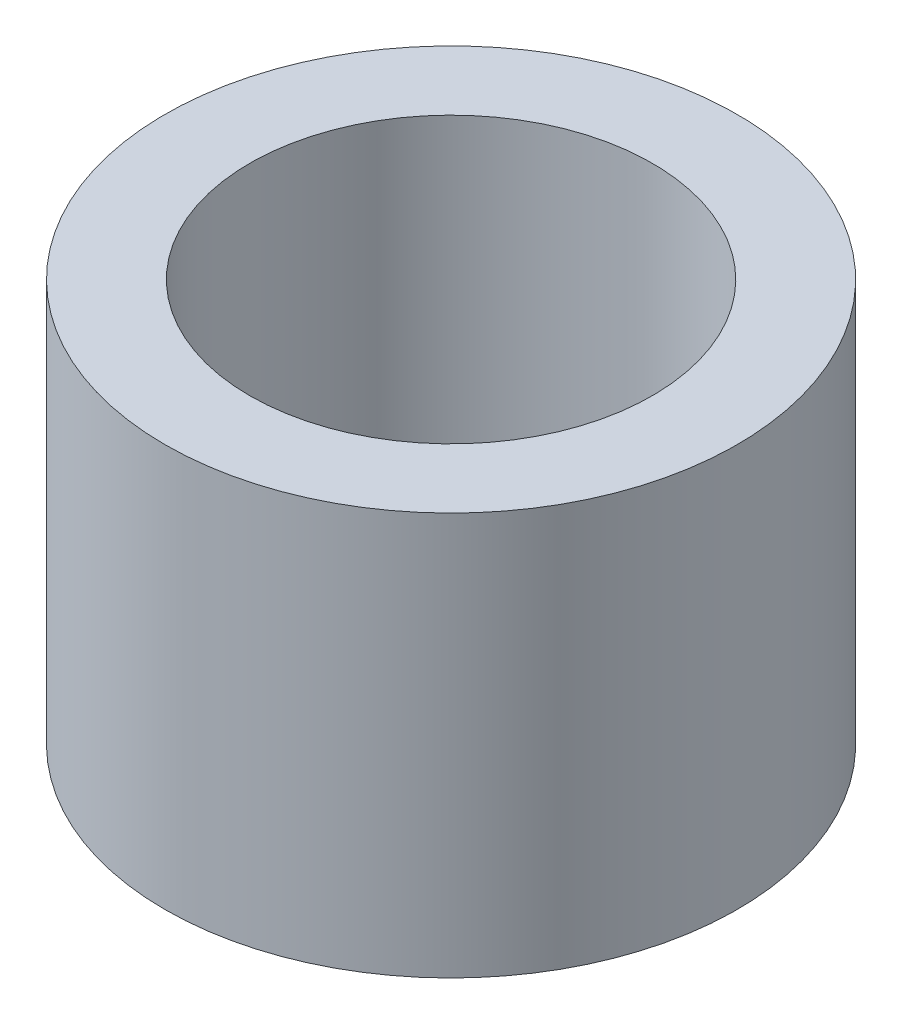
ISO-10303-21;
HEADER;
FILE_DESCRIPTION(('STEP AP214'),'2;1');
FILE_NAME('part.step','',(''),(''),'','','');
FILE_SCHEMA(('AUTOMOTIVE_DESIGN { 1 0 10303 214 1 1 1 1 }'));
ENDSEC;
DATA;
#1=APPLICATION_CONTEXT('core data for automotive mechanical design processes');
#2=APPLICATION_PROTOCOL_DEFINITION('international standard','automotive_design',2000,#1);
#3=PRODUCT_CONTEXT('',#1,'mechanical');
#4=PRODUCT('Part','Part','',(#3));
#5=PRODUCT_RELATED_PRODUCT_CATEGORY('part','',(#4));
#6=PRODUCT_DEFINITION_FORMATION('','',#4);
#7=PRODUCT_DEFINITION_CONTEXT('part definition',#1,'design');
#8=PRODUCT_DEFINITION('design','',#6,#7);
#9=PRODUCT_DEFINITION_SHAPE('','',#8);
#10=(LENGTH_UNIT() NAMED_UNIT(*) SI_UNIT(.MILLI.,.METRE.));
#11=(NAMED_UNIT(*) PLANE_ANGLE_UNIT() SI_UNIT($,.RADIAN.));
#12=(NAMED_UNIT(*) SI_UNIT($,.STERADIAN.) SOLID_ANGLE_UNIT());
#13=UNCERTAINTY_MEASURE_WITH_UNIT(LENGTH_MEASURE(1.E-05),#10,'distance_accuracy_value','');
#14=(GEOMETRIC_REPRESENTATION_CONTEXT(3) GLOBAL_UNCERTAINTY_ASSIGNED_CONTEXT((#13)) GLOBAL_UNIT_ASSIGNED_CONTEXT((#10,
#11,#12)) REPRESENTATION_CONTEXT('',''));
#15=CARTESIAN_POINT('',(0.,0.,0.));
#16=DIRECTION('',(0.,0.,1.));
#17=DIRECTION('',(1.,0.,0.));
#18=AXIS2_PLACEMENT_3D('',#15,#16,#17);
#19=CARTESIAN_POINT('',(0.,19.,0.));
#20=DIRECTION('',(0.,1.,0.));
#21=DIRECTION('',(0.,0.,1.));
#22=AXIS2_PLACEMENT_3D('',#19,#20,#21);
#23=PLANE('',#22);
#24=CARTESIAN_POINT('',(0.,19.,0.));
#25=DIRECTION('',(0.,1.,0.));
#26=DIRECTION('',(0.,0.,1.));
#27=AXIS2_PLACEMENT_3D('',#24,#25,#26);
#28=CIRCLE('',#27,13.5);
#29=CARTESIAN_POINT('',(0.,19.,13.5));
#30=VERTEX_POINT('',#29);
#31=EDGE_CURVE('E10',#30,#30,#28,.T.);
#32=ORIENTED_EDGE('',*,*,#31,.T.);
#33=EDGE_LOOP('',(#32));
#34=FACE_BOUND('',#33,.T.);
#35=CARTESIAN_POINT('',(0.,19.,0.));
#36=DIRECTION('',(0.,1.,0.));
#37=DIRECTION('',(0.,0.,1.));
#38=AXIS2_PLACEMENT_3D('',#35,#36,#37);
#39=CIRCLE('',#38,9.5);
#40=CARTESIAN_POINT('',(0.,19.,9.5));
#41=VERTEX_POINT('',#40);
#42=EDGE_CURVE('E50',#41,#41,#39,.T.);
#43=ORIENTED_EDGE('',*,*,#42,.F.);
#44=EDGE_LOOP('',(#43));
#45=FACE_BOUND('',#44,.T.);
#46=ADVANCED_FACE('F39',(#34,#45),#23,.T.);
#47=CARTESIAN_POINT('',(0.,0.,0.));
#48=DIRECTION('',(0.,1.,0.));
#49=DIRECTION('',(0.,0.,1.));
#50=AXIS2_PLACEMENT_3D('',#47,#48,#49);
#51=PLANE('',#50);
#52=CARTESIAN_POINT('',(0.,0.,0.));
#53=DIRECTION('',(0.,1.,0.));
#54=DIRECTION('',(0.,0.,1.));
#55=AXIS2_PLACEMENT_3D('',#52,#53,#54);
#56=CIRCLE('',#55,13.5);
#57=CARTESIAN_POINT('',(0.,0.,13.5));
#58=VERTEX_POINT('',#57);
#59=EDGE_CURVE('E43',#58,#58,#56,.T.);
#60=ORIENTED_EDGE('',*,*,#59,.F.);
#61=EDGE_LOOP('',(#60));
#62=FACE_BOUND('',#61,.T.);
#63=CARTESIAN_POINT('',(0.,0.,0.));
#64=DIRECTION('',(0.,1.,0.));
#65=DIRECTION('',(0.,0.,1.));
#66=AXIS2_PLACEMENT_3D('',#63,#64,#65);
#67=CIRCLE('',#66,9.5);
#68=CARTESIAN_POINT('',(0.,0.,9.5));
#69=VERTEX_POINT('',#68);
#70=EDGE_CURVE('E52',#69,#69,#67,.T.);
#71=ORIENTED_EDGE('',*,*,#70,.T.);
#72=EDGE_LOOP('',(#71));
#73=FACE_BOUND('',#72,.T.);
#74=ADVANCED_FACE('F62',(#62,#73),#51,.F.);
#75=CARTESIAN_POINT('',(0.,19.,0.));
#76=DIRECTION('',(0.,-1.,0.));
#77=DIRECTION('',(0.,0.,-1.));
#78=AXIS2_PLACEMENT_3D('',#75,#76,#77);
#79=CYLINDRICAL_SURFACE('',#78,13.5);
#80=ORIENTED_EDGE('',*,*,#31,.F.);
#81=EDGE_LOOP('',(#80));
#82=FACE_BOUND('',#81,.T.);
#83=ORIENTED_EDGE('',*,*,#59,.T.);
#84=EDGE_LOOP('',(#83));
#85=FACE_BOUND('',#84,.T.);
#86=ADVANCED_FACE('F41',(#82,#85),#79,.T.);
#87=CARTESIAN_POINT('',(0.,19.,0.));
#88=DIRECTION('',(0.,-1.,0.));
#89=DIRECTION('',(0.,0.,-1.));
#90=AXIS2_PLACEMENT_3D('',#87,#88,#89);
#91=CYLINDRICAL_SURFACE('',#90,9.5);
#92=ORIENTED_EDGE('',*,*,#42,.T.);
#93=EDGE_LOOP('',(#92));
#94=FACE_BOUND('',#93,.T.);
#95=ORIENTED_EDGE('',*,*,#70,.F.);
#96=EDGE_LOOP('',(#95));
#97=FACE_BOUND('',#96,.T.);
#98=ADVANCED_FACE('F58',(#94,#97),#91,.F.);
#99=CLOSED_SHELL('',(#46,#74,#86,#98));
#100=MANIFOLD_SOLID_BREP('B2',#99);
#101=ADVANCED_BREP_SHAPE_REPRESENTATION('',(#18,#100),#14);
#102=SHAPE_DEFINITION_REPRESENTATION(#9,#101);
ENDSEC;
END-ISO-10303-21;
